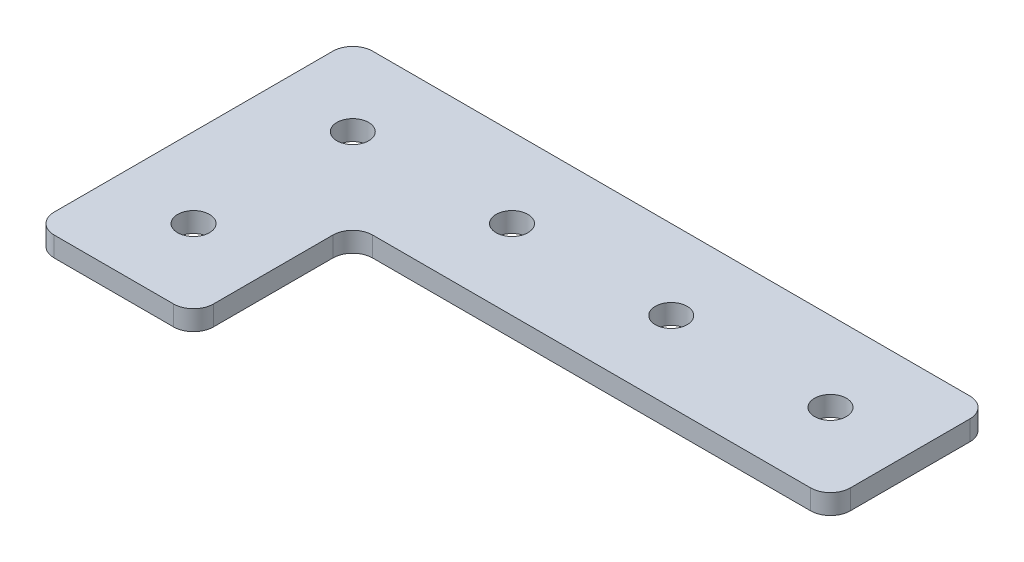
ISO-10303-21;
HEADER;
FILE_DESCRIPTION(('STEP AP214'),'2;1');
FILE_NAME('part.step','',(''),(''),'','','');
FILE_SCHEMA(('AUTOMOTIVE_DESIGN { 1 0 10303 214 1 1 1 1 }'));
ENDSEC;
DATA;
#1=APPLICATION_CONTEXT('core data for automotive mechanical design processes');
#2=APPLICATION_PROTOCOL_DEFINITION('international standard','automotive_design',2000,#1);
#3=PRODUCT_CONTEXT('',#1,'mechanical');
#4=PRODUCT('Part','Part','',(#3));
#5=PRODUCT_RELATED_PRODUCT_CATEGORY('part','',(#4));
#6=PRODUCT_DEFINITION_FORMATION('','',#4);
#7=PRODUCT_DEFINITION_CONTEXT('part definition',#1,'design');
#8=PRODUCT_DEFINITION('design','',#6,#7);
#9=PRODUCT_DEFINITION_SHAPE('','',#8);
#10=(LENGTH_UNIT() NAMED_UNIT(*) SI_UNIT(.MILLI.,.METRE.));
#11=(NAMED_UNIT(*) PLANE_ANGLE_UNIT() SI_UNIT($,.RADIAN.));
#12=(NAMED_UNIT(*) SI_UNIT($,.STERADIAN.) SOLID_ANGLE_UNIT());
#13=UNCERTAINTY_MEASURE_WITH_UNIT(LENGTH_MEASURE(1.E-05),#10,'distance_accuracy_value','');
#14=(GEOMETRIC_REPRESENTATION_CONTEXT(3) GLOBAL_UNCERTAINTY_ASSIGNED_CONTEXT((#13)) GLOBAL_UNIT_ASSIGNED_CONTEXT((#10,
#11,#12)) REPRESENTATION_CONTEXT('',''));
#15=CARTESIAN_POINT('',(0.,0.,0.));
#16=DIRECTION('',(0.,0.,1.));
#17=DIRECTION('',(1.,0.,0.));
#18=AXIS2_PLACEMENT_3D('',#15,#16,#17);
#19=CARTESIAN_POINT('',(12.7,3.175,0.));
#20=DIRECTION('',(1.,0.,0.));
#21=DIRECTION('',(0.,0.,-1.));
#22=AXIS2_PLACEMENT_3D('',#19,#20,#21);
#23=PLANE('',#22);
#24=DIRECTION('',(0.,0.,1.));
#25=VECTOR('',#24,1.);
#26=CARTESIAN_POINT('',(12.7,3.175,0.));
#27=LINE('',#26,#25);
#28=CARTESIAN_POINT('',(12.7,3.175,15.875));
#29=VERTEX_POINT('',#28);
#30=CARTESIAN_POINT('',(12.7,3.175,34.925));
#31=VERTEX_POINT('',#30);
#32=EDGE_CURVE('E243',#29,#31,#27,.T.);
#33=ORIENTED_EDGE('',*,*,#32,.T.);
#34=DIRECTION('',(0.,-1.,0.));
#35=VECTOR('',#34,1.);
#36=CARTESIAN_POINT('',(12.7,0.,34.925));
#37=LINE('',#36,#35);
#38=CARTESIAN_POINT('',(12.7,0.,34.925));
#39=VERTEX_POINT('',#38);
#40=EDGE_CURVE('E150',#31,#39,#37,.T.);
#41=ORIENTED_EDGE('',*,*,#40,.T.);
#42=DIRECTION('',(0.,0.,1.));
#43=VECTOR('',#42,1.);
#44=CARTESIAN_POINT('',(12.7,0.,0.));
#45=LINE('',#44,#43);
#46=CARTESIAN_POINT('',(12.7,0.,15.875));
#47=VERTEX_POINT('',#46);
#48=EDGE_CURVE('E135',#47,#39,#45,.T.);
#49=ORIENTED_EDGE('',*,*,#48,.F.);
#50=DIRECTION('',(0.,-1.,0.));
#51=VECTOR('',#50,1.);
#52=CARTESIAN_POINT('',(12.7,3.175,15.875));
#53=LINE('',#52,#51);
#54=EDGE_CURVE('E147',#47,#29,#53,.F.);
#55=ORIENTED_EDGE('',*,*,#54,.T.);
#56=EDGE_LOOP('',(#33,#41,#49,#55));
#57=FACE_BOUND('',#56,.T.);
#58=ADVANCED_FACE('F41',(#57),#23,.T.);
#59=CARTESIAN_POINT('',(0.,3.175,12.7));
#60=DIRECTION('',(0.,0.,1.));
#61=DIRECTION('',(1.,0.,0.));
#62=AXIS2_PLACEMENT_3D('',#59,#60,#61);
#63=PLANE('',#62);
#64=DIRECTION('',(-1.,0.,0.));
#65=VECTOR('',#64,1.);
#66=CARTESIAN_POINT('',(0.,0.,12.7));
#67=LINE('',#66,#65);
#68=CARTESIAN_POINT('',(85.725,0.,12.7));
#69=VERTEX_POINT('',#68);
#70=CARTESIAN_POINT('',(15.875,0.,12.7));
#71=VERTEX_POINT('',#70);
#72=EDGE_CURVE('E137',#69,#71,#67,.T.);
#73=ORIENTED_EDGE('',*,*,#72,.F.);
#74=DIRECTION('',(0.,-1.,0.));
#75=VECTOR('',#74,1.);
#76=CARTESIAN_POINT('',(85.725,3.175,12.7));
#77=LINE('',#76,#75);
#78=CARTESIAN_POINT('',(85.725,3.175,12.7));
#79=VERTEX_POINT('',#78);
#80=EDGE_CURVE('E143',#69,#79,#77,.F.);
#81=ORIENTED_EDGE('',*,*,#80,.T.);
#82=DIRECTION('',(-1.,0.,0.));
#83=VECTOR('',#82,1.);
#84=CARTESIAN_POINT('',(0.,3.175,12.7));
#85=LINE('',#84,#83);
#86=CARTESIAN_POINT('',(15.875,3.175,12.7));
#87=VERTEX_POINT('',#86);
#88=EDGE_CURVE('E233',#79,#87,#85,.T.);
#89=ORIENTED_EDGE('',*,*,#88,.T.);
#90=DIRECTION('',(0.,-1.,0.));
#91=VECTOR('',#90,1.);
#92=CARTESIAN_POINT('',(15.875,0.,12.7));
#93=LINE('',#92,#91);
#94=EDGE_CURVE('E224',#87,#71,#93,.T.);
#95=ORIENTED_EDGE('',*,*,#94,.T.);
#96=EDGE_LOOP('',(#73,#81,#89,#95));
#97=FACE_BOUND('',#96,.T.);
#98=ADVANCED_FACE('F232',(#97),#63,.T.);
#99=CARTESIAN_POINT('',(88.9,3.175,0.));
#100=DIRECTION('',(-1.,0.,0.));
#101=DIRECTION('',(0.,0.,1.));
#102=AXIS2_PLACEMENT_3D('',#99,#100,#101);
#103=PLANE('',#102);
#104=DIRECTION('',(0.,0.,-1.));
#105=VECTOR('',#104,1.);
#106=CARTESIAN_POINT('',(88.9,0.,0.));
#107=LINE('',#106,#105);
#108=CARTESIAN_POINT('',(88.9,0.,9.525));
#109=VERTEX_POINT('',#108);
#110=CARTESIAN_POINT('',(88.9,0.,-9.525));
#111=VERTEX_POINT('',#110);
#112=EDGE_CURVE('E251',#109,#111,#107,.T.);
#113=ORIENTED_EDGE('',*,*,#112,.T.);
#114=DIRECTION('',(0.,-1.,0.));
#115=VECTOR('',#114,1.);
#116=CARTESIAN_POINT('',(88.9,3.175,-9.525));
#117=LINE('',#116,#115);
#118=CARTESIAN_POINT('',(88.9,3.175,-9.525));
#119=VERTEX_POINT('',#118);
#120=EDGE_CURVE('E221',#111,#119,#117,.F.);
#121=ORIENTED_EDGE('',*,*,#120,.T.);
#122=DIRECTION('',(0.,0.,-1.));
#123=VECTOR('',#122,1.);
#124=CARTESIAN_POINT('',(88.9,3.175,0.));
#125=LINE('',#124,#123);
#126=CARTESIAN_POINT('',(88.9,3.175,9.525));
#127=VERTEX_POINT('',#126);
#128=EDGE_CURVE('E242',#127,#119,#125,.T.);
#129=ORIENTED_EDGE('',*,*,#128,.F.);
#130=DIRECTION('',(0.,-1.,0.));
#131=VECTOR('',#130,1.);
#132=CARTESIAN_POINT('',(88.9,0.,9.525));
#133=LINE('',#132,#131);
#134=EDGE_CURVE('E217',#127,#109,#133,.T.);
#135=ORIENTED_EDGE('',*,*,#134,.T.);
#136=EDGE_LOOP('',(#113,#121,#129,#135));
#137=FACE_BOUND('',#136,.T.);
#138=ADVANCED_FACE('F250',(#137),#103,.F.);
#139=CARTESIAN_POINT('',(0.,3.175,-12.7));
#140=DIRECTION('',(0.,0.,-1.));
#141=DIRECTION('',(-1.,0.,0.));
#142=AXIS2_PLACEMENT_3D('',#139,#140,#141);
#143=PLANE('',#142);
#144=DIRECTION('',(1.,0.,0.));
#145=VECTOR('',#144,1.);
#146=CARTESIAN_POINT('',(0.,0.,-12.7));
#147=LINE('',#146,#145);
#148=CARTESIAN_POINT('',(-9.525,0.,-12.7));
#149=VERTEX_POINT('',#148);
#150=CARTESIAN_POINT('',(85.725,0.,-12.7));
#151=VERTEX_POINT('',#150);
#152=EDGE_CURVE('E255',#149,#151,#147,.T.);
#153=ORIENTED_EDGE('',*,*,#152,.F.);
#154=DIRECTION('',(0.,-1.,0.));
#155=VECTOR('',#154,1.);
#156=CARTESIAN_POINT('',(-9.525,3.175,-12.7));
#157=LINE('',#156,#155);
#158=CARTESIAN_POINT('',(-9.525,3.175,-12.7));
#159=VERTEX_POINT('',#158);
#160=EDGE_CURVE('E214',#149,#159,#157,.F.);
#161=ORIENTED_EDGE('',*,*,#160,.T.);
#162=DIRECTION('',(1.,0.,0.));
#163=VECTOR('',#162,1.);
#164=CARTESIAN_POINT('',(0.,3.175,-12.7));
#165=LINE('',#164,#163);
#166=CARTESIAN_POINT('',(85.725,3.175,-12.7));
#167=VERTEX_POINT('',#166);
#168=EDGE_CURVE('E296',#159,#167,#165,.T.);
#169=ORIENTED_EDGE('',*,*,#168,.T.);
#170=DIRECTION('',(0.,-1.,0.));
#171=VECTOR('',#170,1.);
#172=CARTESIAN_POINT('',(85.725,0.,-12.7));
#173=LINE('',#172,#171);
#174=EDGE_CURVE('E210',#167,#151,#173,.T.);
#175=ORIENTED_EDGE('',*,*,#174,.T.);
#176=EDGE_LOOP('',(#153,#161,#169,#175));
#177=FACE_BOUND('',#176,.T.);
#178=ADVANCED_FACE('F346',(#177),#143,.T.);
#179=CARTESIAN_POINT('',(-12.7,3.175,0.));
#180=DIRECTION('',(1.,0.,0.));
#181=DIRECTION('',(0.,0.,-1.));
#182=AXIS2_PLACEMENT_3D('',#179,#180,#181);
#183=PLANE('',#182);
#184=DIRECTION('',(0.,0.,1.));
#185=VECTOR('',#184,1.);
#186=CARTESIAN_POINT('',(-12.7,0.,0.));
#187=LINE('',#186,#185);
#188=CARTESIAN_POINT('',(-12.7,0.,-9.525));
#189=VERTEX_POINT('',#188);
#190=CARTESIAN_POINT('',(-12.7,0.,34.925));
#191=VERTEX_POINT('',#190);
#192=EDGE_CURVE('E259',#189,#191,#187,.T.);
#193=ORIENTED_EDGE('',*,*,#192,.T.);
#194=DIRECTION('',(0.,-1.,0.));
#195=VECTOR('',#194,1.);
#196=CARTESIAN_POINT('',(-12.7,3.175,34.925));
#197=LINE('',#196,#195);
#198=CARTESIAN_POINT('',(-12.7,3.175,34.925));
#199=VERTEX_POINT('',#198);
#200=EDGE_CURVE('E57',#191,#199,#197,.F.);
#201=ORIENTED_EDGE('',*,*,#200,.T.);
#202=DIRECTION('',(0.,0.,1.));
#203=VECTOR('',#202,1.);
#204=CARTESIAN_POINT('',(-12.7,3.175,0.));
#205=LINE('',#204,#203);
#206=CARTESIAN_POINT('',(-12.7,3.175,-9.525));
#207=VERTEX_POINT('',#206);
#208=EDGE_CURVE('E300',#207,#199,#205,.T.);
#209=ORIENTED_EDGE('',*,*,#208,.F.);
#210=DIRECTION('',(0.,-1.,0.));
#211=VECTOR('',#210,1.);
#212=CARTESIAN_POINT('',(-12.7,0.,-9.525));
#213=LINE('',#212,#211);
#214=EDGE_CURVE('E204',#207,#189,#213,.T.);
#215=ORIENTED_EDGE('',*,*,#214,.T.);
#216=EDGE_LOOP('',(#193,#201,#209,#215));
#217=FACE_BOUND('',#216,.T.);
#218=ADVANCED_FACE('F349',(#217),#183,.F.);
#219=CARTESIAN_POINT('',(50.8,3.175,0.));
#220=DIRECTION('',(0.,-1.,0.));
#221=DIRECTION('',(0.,0.,-1.));
#222=AXIS2_PLACEMENT_3D('',#219,#220,#221);
#223=CYLINDRICAL_SURFACE('',#222,2.54);
#224=CARTESIAN_POINT('',(50.8,3.175,0.));
#225=DIRECTION('',(0.,1.,0.));
#226=DIRECTION('',(0.,0.,1.));
#227=AXIS2_PLACEMENT_3D('',#224,#225,#226);
#228=CIRCLE('',#227,2.54);
#229=CARTESIAN_POINT('',(50.8,3.175,2.54));
#230=VERTEX_POINT('',#229);
#231=EDGE_CURVE('E163',#230,#230,#228,.T.);
#232=ORIENTED_EDGE('',*,*,#231,.T.);
#233=EDGE_LOOP('',(#232));
#234=FACE_BOUND('',#233,.T.);
#235=CARTESIAN_POINT('',(50.8,0.,0.));
#236=DIRECTION('',(0.,1.,0.));
#237=DIRECTION('',(0.,0.,1.));
#238=AXIS2_PLACEMENT_3D('',#235,#236,#237);
#239=CIRCLE('',#238,2.54);
#240=CARTESIAN_POINT('',(50.8,0.,2.54));
#241=VERTEX_POINT('',#240);
#242=EDGE_CURVE('E272',#241,#241,#239,.T.);
#243=ORIENTED_EDGE('',*,*,#242,.F.);
#244=EDGE_LOOP('',(#243));
#245=FACE_BOUND('',#244,.T.);
#246=ADVANCED_FACE('F352',(#234,#245),#223,.F.);
#247=CARTESIAN_POINT('',(76.2,3.175,0.));
#248=DIRECTION('',(0.,-1.,0.));
#249=DIRECTION('',(0.,0.,-1.));
#250=AXIS2_PLACEMENT_3D('',#247,#248,#249);
#251=CYLINDRICAL_SURFACE('',#250,2.54);
#252=CARTESIAN_POINT('',(76.2,3.175,0.));
#253=DIRECTION('',(0.,1.,0.));
#254=DIRECTION('',(0.,0.,1.));
#255=AXIS2_PLACEMENT_3D('',#252,#253,#254);
#256=CIRCLE('',#255,2.54);
#257=CARTESIAN_POINT('',(76.2,3.175,2.54));
#258=VERTEX_POINT('',#257);
#259=EDGE_CURVE('E306',#258,#258,#256,.T.);
#260=ORIENTED_EDGE('',*,*,#259,.T.);
#261=EDGE_LOOP('',(#260));
#262=FACE_BOUND('',#261,.T.);
#263=CARTESIAN_POINT('',(76.2,0.,0.));
#264=DIRECTION('',(0.,1.,0.));
#265=DIRECTION('',(0.,0.,1.));
#266=AXIS2_PLACEMENT_3D('',#263,#264,#265);
#267=CIRCLE('',#266,2.54);
#268=CARTESIAN_POINT('',(76.2,0.,2.54));
#269=VERTEX_POINT('',#268);
#270=EDGE_CURVE('E269',#269,#269,#267,.T.);
#271=ORIENTED_EDGE('',*,*,#270,.F.);
#272=EDGE_LOOP('',(#271));
#273=FACE_BOUND('',#272,.T.);
#274=ADVANCED_FACE('F334',(#262,#273),#251,.F.);
#275=CARTESIAN_POINT('',(0.,3.175,38.1));
#276=DIRECTION('',(0.,0.,-1.));
#277=DIRECTION('',(-1.,0.,0.));
#278=AXIS2_PLACEMENT_3D('',#275,#276,#277);
#279=PLANE('',#278);
#280=DIRECTION('',(1.,0.,0.));
#281=VECTOR('',#280,1.);
#282=CARTESIAN_POINT('',(0.,0.,38.1));
#283=LINE('',#282,#281);
#284=CARTESIAN_POINT('',(-9.525,0.,38.1));
#285=VERTEX_POINT('',#284);
#286=CARTESIAN_POINT('',(9.525,0.,38.1));
#287=VERTEX_POINT('',#286);
#288=EDGE_CURVE('E265',#285,#287,#283,.T.);
#289=ORIENTED_EDGE('',*,*,#288,.T.);
#290=DIRECTION('',(0.,-1.,0.));
#291=VECTOR('',#290,1.);
#292=CARTESIAN_POINT('',(9.525,3.175,38.1));
#293=LINE('',#292,#291);
#294=CARTESIAN_POINT('',(9.525,3.175,38.1));
#295=VERTEX_POINT('',#294);
#296=EDGE_CURVE('E187',#287,#295,#293,.F.);
#297=ORIENTED_EDGE('',*,*,#296,.T.);
#298=DIRECTION('',(1.,0.,0.));
#299=VECTOR('',#298,1.);
#300=CARTESIAN_POINT('',(0.,3.175,38.1));
#301=LINE('',#300,#299);
#302=CARTESIAN_POINT('',(-9.525,3.175,38.1));
#303=VERTEX_POINT('',#302);
#304=EDGE_CURVE('E303',#303,#295,#301,.T.);
#305=ORIENTED_EDGE('',*,*,#304,.F.);
#306=DIRECTION('',(0.,-1.,0.));
#307=VECTOR('',#306,1.);
#308=CARTESIAN_POINT('',(-9.525,3.175,38.1));
#309=LINE('',#308,#307);
#310=EDGE_CURVE('E183',#303,#285,#309,.T.);
#311=ORIENTED_EDGE('',*,*,#310,.T.);
#312=EDGE_LOOP('',(#289,#297,#305,#311));
#313=FACE_BOUND('',#312,.T.);
#314=ADVANCED_FACE('F325',(#313),#279,.F.);
#315=CARTESIAN_POINT('',(0.,3.175,25.4));
#316=DIRECTION('',(0.,-1.,0.));
#317=DIRECTION('',(0.,0.,-1.));
#318=AXIS2_PLACEMENT_3D('',#315,#316,#317);
#319=CYLINDRICAL_SURFACE('',#318,2.54);
#320=CARTESIAN_POINT('',(0.,3.175,25.4));
#321=DIRECTION('',(0.,1.,0.));
#322=DIRECTION('',(0.,0.,1.));
#323=AXIS2_PLACEMENT_3D('',#320,#321,#322);
#324=CIRCLE('',#323,2.54);
#325=CARTESIAN_POINT('',(0.,3.175,27.94));
#326=VERTEX_POINT('',#325);
#327=EDGE_CURVE('E284',#326,#326,#324,.T.);
#328=ORIENTED_EDGE('',*,*,#327,.T.);
#329=EDGE_LOOP('',(#328));
#330=FACE_BOUND('',#329,.T.);
#331=CARTESIAN_POINT('',(0.,0.,25.4));
#332=DIRECTION('',(0.,1.,0.));
#333=DIRECTION('',(0.,0.,1.));
#334=AXIS2_PLACEMENT_3D('',#331,#332,#333);
#335=CIRCLE('',#334,2.54);
#336=CARTESIAN_POINT('',(0.,0.,27.94));
#337=VERTEX_POINT('',#336);
#338=EDGE_CURVE('E152',#337,#337,#335,.T.);
#339=ORIENTED_EDGE('',*,*,#338,.F.);
#340=EDGE_LOOP('',(#339));
#341=FACE_BOUND('',#340,.T.);
#342=ADVANCED_FACE('F322',(#330,#341),#319,.F.);
#343=CARTESIAN_POINT('',(0.,3.175,0.));
#344=DIRECTION('',(0.,-1.,0.));
#345=DIRECTION('',(0.,0.,-1.));
#346=AXIS2_PLACEMENT_3D('',#343,#344,#345);
#347=CYLINDRICAL_SURFACE('',#346,2.54);
#348=CARTESIAN_POINT('',(0.,3.175,0.));
#349=DIRECTION('',(0.,1.,0.));
#350=DIRECTION('',(0.,0.,1.));
#351=AXIS2_PLACEMENT_3D('',#348,#349,#350);
#352=CIRCLE('',#351,2.54);
#353=CARTESIAN_POINT('',(0.,3.175,2.54));
#354=VERTEX_POINT('',#353);
#355=EDGE_CURVE('E279',#354,#354,#352,.T.);
#356=ORIENTED_EDGE('',*,*,#355,.T.);
#357=EDGE_LOOP('',(#356));
#358=FACE_BOUND('',#357,.T.);
#359=CARTESIAN_POINT('',(0.,0.,0.));
#360=DIRECTION('',(0.,1.,0.));
#361=DIRECTION('',(0.,0.,1.));
#362=AXIS2_PLACEMENT_3D('',#359,#360,#361);
#363=CIRCLE('',#362,2.54);
#364=CARTESIAN_POINT('',(0.,0.,2.54));
#365=VERTEX_POINT('',#364);
#366=EDGE_CURVE('E313',#365,#365,#363,.T.);
#367=ORIENTED_EDGE('',*,*,#366,.F.);
#368=EDGE_LOOP('',(#367));
#369=FACE_BOUND('',#368,.T.);
#370=ADVANCED_FACE('F324',(#358,#369),#347,.F.);
#371=CARTESIAN_POINT('',(25.4,3.175,0.));
#372=DIRECTION('',(0.,-1.,0.));
#373=DIRECTION('',(0.,0.,-1.));
#374=AXIS2_PLACEMENT_3D('',#371,#372,#373);
#375=CYLINDRICAL_SURFACE('',#374,2.54);
#376=CARTESIAN_POINT('',(25.4,3.175,0.));
#377=DIRECTION('',(0.,1.,0.));
#378=DIRECTION('',(0.,0.,1.));
#379=AXIS2_PLACEMENT_3D('',#376,#377,#378);
#380=CIRCLE('',#379,2.54);
#381=CARTESIAN_POINT('',(25.4,3.175,2.54));
#382=VERTEX_POINT('',#381);
#383=EDGE_CURVE('E156',#382,#382,#380,.T.);
#384=ORIENTED_EDGE('',*,*,#383,.T.);
#385=EDGE_LOOP('',(#384));
#386=FACE_BOUND('',#385,.T.);
#387=CARTESIAN_POINT('',(25.4,0.,0.));
#388=DIRECTION('',(0.,1.,0.));
#389=DIRECTION('',(0.,0.,1.));
#390=AXIS2_PLACEMENT_3D('',#387,#388,#389);
#391=CIRCLE('',#390,2.54);
#392=CARTESIAN_POINT('',(25.4,0.,2.54));
#393=VERTEX_POINT('',#392);
#394=EDGE_CURVE('E166',#393,#393,#391,.T.);
#395=ORIENTED_EDGE('',*,*,#394,.F.);
#396=EDGE_LOOP('',(#395));
#397=FACE_BOUND('',#396,.T.);
#398=ADVANCED_FACE('F332',(#386,#397),#375,.F.);
#399=CARTESIAN_POINT('',(0.,3.175,0.));
#400=DIRECTION('',(0.,1.,0.));
#401=DIRECTION('',(0.,0.,1.));
#402=AXIS2_PLACEMENT_3D('',#399,#400,#401);
#403=PLANE('',#402);
#404=ORIENTED_EDGE('',*,*,#355,.F.);
#405=EDGE_LOOP('',(#404));
#406=FACE_BOUND('',#405,.T.);
#407=ORIENTED_EDGE('',*,*,#327,.F.);
#408=EDGE_LOOP('',(#407));
#409=FACE_BOUND('',#408,.T.);
#410=ORIENTED_EDGE('',*,*,#304,.T.);
#411=CARTESIAN_POINT('',(9.525,3.175,34.925));
#412=DIRECTION('',(0.,1.,0.));
#413=DIRECTION('',(0.,0.,1.));
#414=AXIS2_PLACEMENT_3D('',#411,#412,#413);
#415=CIRCLE('',#414,3.175);
#416=EDGE_CURVE('E201',#295,#31,#415,.T.);
#417=ORIENTED_EDGE('',*,*,#416,.T.);
#418=ORIENTED_EDGE('',*,*,#32,.F.);
#419=CARTESIAN_POINT('',(15.875,3.175,15.875));
#420=DIRECTION('',(0.,1.,0.));
#421=DIRECTION('',(0.,0.,1.));
#422=AXIS2_PLACEMENT_3D('',#419,#420,#421);
#423=CIRCLE('',#422,3.175);
#424=EDGE_CURVE('E11',#29,#87,#423,.F.);
#425=ORIENTED_EDGE('',*,*,#424,.T.);
#426=ORIENTED_EDGE('',*,*,#88,.F.);
#427=CARTESIAN_POINT('',(85.725,3.175,9.525));
#428=DIRECTION('',(0.,1.,0.));
#429=DIRECTION('',(0.,0.,1.));
#430=AXIS2_PLACEMENT_3D('',#427,#428,#429);
#431=CIRCLE('',#430,3.175);
#432=EDGE_CURVE('E190',#79,#127,#431,.T.);
#433=ORIENTED_EDGE('',*,*,#432,.T.);
#434=ORIENTED_EDGE('',*,*,#128,.T.);
#435=CARTESIAN_POINT('',(85.725,3.175,-9.525));
#436=DIRECTION('',(0.,1.,0.));
#437=DIRECTION('',(0.,0.,1.));
#438=AXIS2_PLACEMENT_3D('',#435,#436,#437);
#439=CIRCLE('',#438,3.175);
#440=EDGE_CURVE('E193',#119,#167,#439,.T.);
#441=ORIENTED_EDGE('',*,*,#440,.T.);
#442=ORIENTED_EDGE('',*,*,#168,.F.);
#443=CARTESIAN_POINT('',(-9.525,3.175,-9.525));
#444=DIRECTION('',(0.,1.,0.));
#445=DIRECTION('',(0.,0.,1.));
#446=AXIS2_PLACEMENT_3D('',#443,#444,#445);
#447=CIRCLE('',#446,3.175);
#448=EDGE_CURVE('E64',#159,#207,#447,.T.);
#449=ORIENTED_EDGE('',*,*,#448,.T.);
#450=ORIENTED_EDGE('',*,*,#208,.T.);
#451=CARTESIAN_POINT('',(-9.525,3.175,34.925));
#452=DIRECTION('',(0.,1.,0.));
#453=DIRECTION('',(0.,0.,1.));
#454=AXIS2_PLACEMENT_3D('',#451,#452,#453);
#455=CIRCLE('',#454,3.175);
#456=EDGE_CURVE('E198',#199,#303,#455,.T.);
#457=ORIENTED_EDGE('',*,*,#456,.T.);
#458=EDGE_LOOP('',(#410,#417,#418,#425,#426,#433,#434,#441,#442,#449,#450,#457));
#459=FACE_BOUND('',#458,.T.);
#460=ORIENTED_EDGE('',*,*,#259,.F.);
#461=EDGE_LOOP('',(#460));
#462=FACE_BOUND('',#461,.T.);
#463=ORIENTED_EDGE('',*,*,#231,.F.);
#464=EDGE_LOOP('',(#463));
#465=FACE_BOUND('',#464,.T.);
#466=ORIENTED_EDGE('',*,*,#383,.F.);
#467=EDGE_LOOP('',(#466));
#468=FACE_BOUND('',#467,.T.);
#469=ADVANCED_FACE('F237',(#406,#409,#459,#462,#465,#468),#403,.T.);
#470=CARTESIAN_POINT('',(0.,0.,0.));
#471=DIRECTION('',(0.,1.,0.));
#472=DIRECTION('',(0.,0.,1.));
#473=AXIS2_PLACEMENT_3D('',#470,#471,#472);
#474=PLANE('',#473);
#475=ORIENTED_EDGE('',*,*,#366,.T.);
#476=EDGE_LOOP('',(#475));
#477=FACE_BOUND('',#476,.T.);
#478=ORIENTED_EDGE('',*,*,#338,.T.);
#479=EDGE_LOOP('',(#478));
#480=FACE_BOUND('',#479,.T.);
#481=ORIENTED_EDGE('',*,*,#48,.T.);
#482=CARTESIAN_POINT('',(9.525,0.,34.925));
#483=DIRECTION('',(0.,1.,0.));
#484=DIRECTION('',(0.,0.,1.));
#485=AXIS2_PLACEMENT_3D('',#482,#483,#484);
#486=CIRCLE('',#485,3.175);
#487=EDGE_CURVE('E180',#39,#287,#486,.F.);
#488=ORIENTED_EDGE('',*,*,#487,.T.);
#489=ORIENTED_EDGE('',*,*,#288,.F.);
#490=CARTESIAN_POINT('',(-9.525,0.,34.925));
#491=DIRECTION('',(0.,1.,0.));
#492=DIRECTION('',(0.,0.,1.));
#493=AXIS2_PLACEMENT_3D('',#490,#491,#492);
#494=CIRCLE('',#493,3.175);
#495=EDGE_CURVE('E177',#285,#191,#494,.F.);
#496=ORIENTED_EDGE('',*,*,#495,.T.);
#497=ORIENTED_EDGE('',*,*,#192,.F.);
#498=CARTESIAN_POINT('',(-9.525,0.,-9.525));
#499=DIRECTION('',(0.,1.,0.));
#500=DIRECTION('',(0.,0.,1.));
#501=AXIS2_PLACEMENT_3D('',#498,#499,#500);
#502=CIRCLE('',#501,3.175);
#503=EDGE_CURVE('E174',#189,#149,#502,.F.);
#504=ORIENTED_EDGE('',*,*,#503,.T.);
#505=ORIENTED_EDGE('',*,*,#152,.T.);
#506=CARTESIAN_POINT('',(85.725,0.,-9.525));
#507=DIRECTION('',(0.,1.,0.));
#508=DIRECTION('',(0.,0.,1.));
#509=AXIS2_PLACEMENT_3D('',#506,#507,#508);
#510=CIRCLE('',#509,3.175);
#511=EDGE_CURVE('E171',#151,#111,#510,.F.);
#512=ORIENTED_EDGE('',*,*,#511,.T.);
#513=ORIENTED_EDGE('',*,*,#112,.F.);
#514=CARTESIAN_POINT('',(85.725,0.,9.525));
#515=DIRECTION('',(0.,1.,0.));
#516=DIRECTION('',(0.,0.,1.));
#517=AXIS2_PLACEMENT_3D('',#514,#515,#516);
#518=CIRCLE('',#517,3.175);
#519=EDGE_CURVE('E160',#109,#69,#518,.F.);
#520=ORIENTED_EDGE('',*,*,#519,.T.);
#521=ORIENTED_EDGE('',*,*,#72,.T.);
#522=CARTESIAN_POINT('',(15.875,0.,15.875));
#523=DIRECTION('',(0.,1.,0.));
#524=DIRECTION('',(0.,0.,1.));
#525=AXIS2_PLACEMENT_3D('',#522,#523,#524);
#526=CIRCLE('',#525,3.175);
#527=EDGE_CURVE('E50',#71,#47,#526,.T.);
#528=ORIENTED_EDGE('',*,*,#527,.T.);
#529=EDGE_LOOP('',(#481,#488,#489,#496,#497,#504,#505,#512,#513,#520,#521,#528));
#530=FACE_BOUND('',#529,.T.);
#531=ORIENTED_EDGE('',*,*,#270,.T.);
#532=EDGE_LOOP('',(#531));
#533=FACE_BOUND('',#532,.T.);
#534=ORIENTED_EDGE('',*,*,#242,.T.);
#535=EDGE_LOOP('',(#534));
#536=FACE_BOUND('',#535,.T.);
#537=ORIENTED_EDGE('',*,*,#394,.T.);
#538=EDGE_LOOP('',(#537));
#539=FACE_BOUND('',#538,.T.);
#540=ADVANCED_FACE('F133',(#477,#480,#530,#533,#536,#539),#474,.F.);
#541=CARTESIAN_POINT('',(9.525,3.175,34.925));
#542=DIRECTION('',(0.,1.,0.));
#543=DIRECTION('',(0.,0.,1.));
#544=AXIS2_PLACEMENT_3D('',#541,#542,#543);
#545=CYLINDRICAL_SURFACE('',#544,3.175);
#546=ORIENTED_EDGE('',*,*,#416,.F.);
#547=ORIENTED_EDGE('',*,*,#296,.F.);
#548=ORIENTED_EDGE('',*,*,#487,.F.);
#549=ORIENTED_EDGE('',*,*,#40,.F.);
#550=EDGE_LOOP('',(#546,#547,#548,#549));
#551=FACE_BOUND('',#550,.T.);
#552=ADVANCED_FACE('F365',(#551),#545,.T.);
#553=CARTESIAN_POINT('',(-9.525,3.175,34.925));
#554=DIRECTION('',(0.,-1.,0.));
#555=DIRECTION('',(0.,0.,-1.));
#556=AXIS2_PLACEMENT_3D('',#553,#554,#555);
#557=CYLINDRICAL_SURFACE('',#556,3.175);
#558=ORIENTED_EDGE('',*,*,#456,.F.);
#559=ORIENTED_EDGE('',*,*,#200,.F.);
#560=ORIENTED_EDGE('',*,*,#495,.F.);
#561=ORIENTED_EDGE('',*,*,#310,.F.);
#562=EDGE_LOOP('',(#558,#559,#560,#561));
#563=FACE_BOUND('',#562,.T.);
#564=ADVANCED_FACE('F386',(#563),#557,.T.);
#565=CARTESIAN_POINT('',(-9.525,3.175,-9.525));
#566=DIRECTION('',(0.,1.,0.));
#567=DIRECTION('',(0.,0.,1.));
#568=AXIS2_PLACEMENT_3D('',#565,#566,#567);
#569=CYLINDRICAL_SURFACE('',#568,3.175);
#570=ORIENTED_EDGE('',*,*,#448,.F.);
#571=ORIENTED_EDGE('',*,*,#160,.F.);
#572=ORIENTED_EDGE('',*,*,#503,.F.);
#573=ORIENTED_EDGE('',*,*,#214,.F.);
#574=EDGE_LOOP('',(#570,#571,#572,#573));
#575=FACE_BOUND('',#574,.T.);
#576=ADVANCED_FACE('F394',(#575),#569,.T.);
#577=CARTESIAN_POINT('',(85.725,3.175,-9.525));
#578=DIRECTION('',(0.,1.,0.));
#579=DIRECTION('',(0.,0.,1.));
#580=AXIS2_PLACEMENT_3D('',#577,#578,#579);
#581=CYLINDRICAL_SURFACE('',#580,3.175);
#582=ORIENTED_EDGE('',*,*,#440,.F.);
#583=ORIENTED_EDGE('',*,*,#120,.F.);
#584=ORIENTED_EDGE('',*,*,#511,.F.);
#585=ORIENTED_EDGE('',*,*,#174,.F.);
#586=EDGE_LOOP('',(#582,#583,#584,#585));
#587=FACE_BOUND('',#586,.T.);
#588=ADVANCED_FACE('F402',(#587),#581,.T.);
#589=CARTESIAN_POINT('',(85.725,3.175,9.525));
#590=DIRECTION('',(0.,1.,0.));
#591=DIRECTION('',(0.,0.,1.));
#592=AXIS2_PLACEMENT_3D('',#589,#590,#591);
#593=CYLINDRICAL_SURFACE('',#592,3.175);
#594=ORIENTED_EDGE('',*,*,#432,.F.);
#595=ORIENTED_EDGE('',*,*,#80,.F.);
#596=ORIENTED_EDGE('',*,*,#519,.F.);
#597=ORIENTED_EDGE('',*,*,#134,.F.);
#598=EDGE_LOOP('',(#594,#595,#596,#597));
#599=FACE_BOUND('',#598,.T.);
#600=ADVANCED_FACE('F246',(#599),#593,.T.);
#601=CARTESIAN_POINT('',(15.875,3.175,15.875));
#602=DIRECTION('',(0.,1.,0.));
#603=DIRECTION('',(0.,0.,1.));
#604=AXIS2_PLACEMENT_3D('',#601,#602,#603);
#605=CYLINDRICAL_SURFACE('',#604,3.175);
#606=ORIENTED_EDGE('',*,*,#424,.F.);
#607=ORIENTED_EDGE('',*,*,#54,.F.);
#608=ORIENTED_EDGE('',*,*,#527,.F.);
#609=ORIENTED_EDGE('',*,*,#94,.F.);
#610=EDGE_LOOP('',(#606,#607,#608,#609));
#611=FACE_BOUND('',#610,.T.);
#612=ADVANCED_FACE('F43',(#611),#605,.F.);
#613=CLOSED_SHELL('',(#58,#98,#138,#178,#218,#246,#274,#314,#342,#370,#398,#469,#540,#552,#564,
#576,#588,#600,#612));
#614=MANIFOLD_SOLID_BREP('B2',#613);
#615=ADVANCED_BREP_SHAPE_REPRESENTATION('',(#18,#614),#14);
#616=SHAPE_DEFINITION_REPRESENTATION(#9,#615);
ENDSEC;
END-ISO-10303-21;
